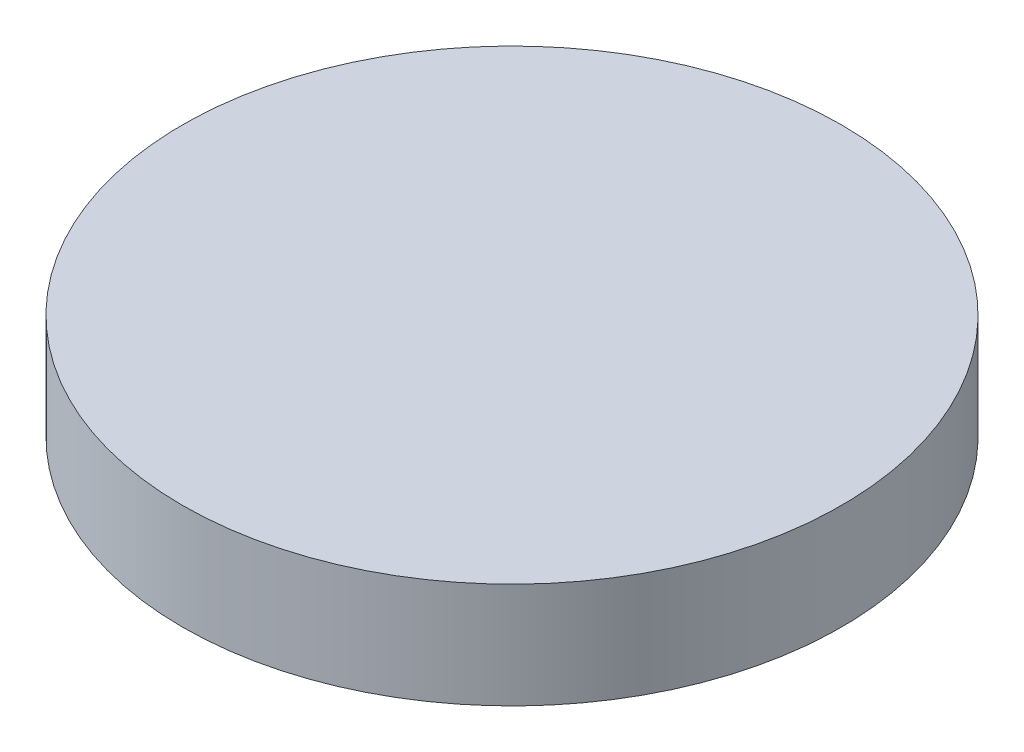
ISO-10303-21;
HEADER;
FILE_DESCRIPTION(('STEP AP214'),'2;1');
FILE_NAME('part.step','',(''),(''),'','','');
FILE_SCHEMA(('AUTOMOTIVE_DESIGN { 1 0 10303 214 1 1 1 1 }'));
ENDSEC;
DATA;
#1=APPLICATION_CONTEXT('core data for automotive mechanical design processes');
#2=APPLICATION_PROTOCOL_DEFINITION('international standard','automotive_design',2000,#1);
#3=PRODUCT_CONTEXT('',#1,'mechanical');
#4=PRODUCT('Part','Part','',(#3));
#5=PRODUCT_RELATED_PRODUCT_CATEGORY('part','',(#4));
#6=PRODUCT_DEFINITION_FORMATION('','',#4);
#7=PRODUCT_DEFINITION_CONTEXT('part definition',#1,'design');
#8=PRODUCT_DEFINITION('design','',#6,#7);
#9=PRODUCT_DEFINITION_SHAPE('','',#8);
#10=(LENGTH_UNIT() NAMED_UNIT(*) SI_UNIT(.MILLI.,.METRE.));
#11=(NAMED_UNIT(*) PLANE_ANGLE_UNIT() SI_UNIT($,.RADIAN.));
#12=(NAMED_UNIT(*) SI_UNIT($,.STERADIAN.) SOLID_ANGLE_UNIT());
#13=UNCERTAINTY_MEASURE_WITH_UNIT(LENGTH_MEASURE(1.E-05),#10,'distance_accuracy_value','');
#14=(GEOMETRIC_REPRESENTATION_CONTEXT(3) GLOBAL_UNCERTAINTY_ASSIGNED_CONTEXT((#13)) GLOBAL_UNIT_ASSIGNED_CONTEXT((#10,
#11,#12)) REPRESENTATION_CONTEXT('',''));
#15=CARTESIAN_POINT('',(0.,0.,0.));
#16=DIRECTION('',(0.,0.,1.));
#17=DIRECTION('',(1.,0.,0.));
#18=AXIS2_PLACEMENT_3D('',#15,#16,#17);
#19=CARTESIAN_POINT('',(0.,4.,0.));
#20=DIRECTION('',(0.,-1.,0.));
#21=DIRECTION('',(0.,0.,-1.));
#22=AXIS2_PLACEMENT_3D('',#19,#20,#21);
#23=CYLINDRICAL_SURFACE('',#22,12.5);
#24=CARTESIAN_POINT('',(0.,4.,0.));
#25=DIRECTION('',(0.,1.,0.));
#26=DIRECTION('',(0.,0.,1.));
#27=AXIS2_PLACEMENT_3D('',#24,#25,#26);
#28=CIRCLE('',#27,12.5);
#29=CARTESIAN_POINT('',(0.,4.,12.5));
#30=VERTEX_POINT('',#29);
#31=EDGE_CURVE('E10',#30,#30,#28,.T.);
#32=ORIENTED_EDGE('',*,*,#31,.F.);
#33=EDGE_LOOP('',(#32));
#34=FACE_BOUND('',#33,.T.);
#35=CARTESIAN_POINT('',(0.,0.,0.));
#36=DIRECTION('',(0.,1.,0.));
#37=DIRECTION('',(0.,0.,1.));
#38=AXIS2_PLACEMENT_3D('',#35,#36,#37);
#39=CIRCLE('',#38,12.5);
#40=CARTESIAN_POINT('',(0.,0.,12.5));
#41=VERTEX_POINT('',#40);
#42=EDGE_CURVE('E34',#41,#41,#39,.T.);
#43=ORIENTED_EDGE('',*,*,#42,.T.);
#44=EDGE_LOOP('',(#43));
#45=FACE_BOUND('',#44,.T.);
#46=ADVANCED_FACE('F31',(#34,#45),#23,.T.);
#47=CARTESIAN_POINT('',(0.,4.,0.));
#48=DIRECTION('',(0.,1.,0.));
#49=DIRECTION('',(0.,0.,1.));
#50=AXIS2_PLACEMENT_3D('',#47,#48,#49);
#51=PLANE('',#50);
#52=ORIENTED_EDGE('',*,*,#31,.T.);
#53=EDGE_LOOP('',(#52));
#54=FACE_BOUND('',#53,.T.);
#55=ADVANCED_FACE('F46',(#54),#51,.T.);
#56=CARTESIAN_POINT('',(0.,0.,0.));
#57=DIRECTION('',(0.,1.,0.));
#58=DIRECTION('',(0.,0.,1.));
#59=AXIS2_PLACEMENT_3D('',#56,#57,#58);
#60=PLANE('',#59);
#61=ORIENTED_EDGE('',*,*,#42,.F.);
#62=EDGE_LOOP('',(#61));
#63=FACE_BOUND('',#62,.T.);
#64=ADVANCED_FACE('F44',(#63),#60,.F.);
#65=CLOSED_SHELL('',(#46,#55,#64));
#66=MANIFOLD_SOLID_BREP('B2',#65);
#67=ADVANCED_BREP_SHAPE_REPRESENTATION('',(#18,#66),#14);
#68=SHAPE_DEFINITION_REPRESENTATION(#9,#67);
ENDSEC;
END-ISO-10303-21;
